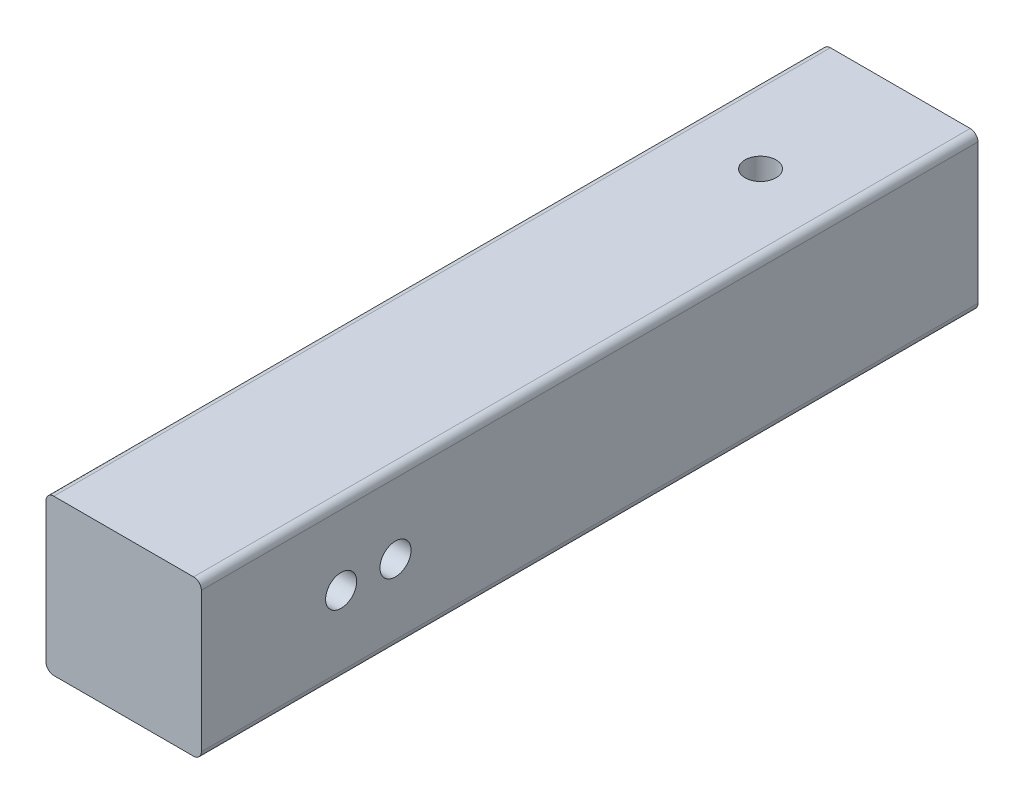
ISO-10303-21;
HEADER;
FILE_DESCRIPTION(('STEP AP214'),'2;1');
FILE_NAME('part.step','',(''),(''),'','','');
FILE_SCHEMA(('AUTOMOTIVE_DESIGN { 1 0 10303 214 1 1 1 1 }'));
ENDSEC;
DATA;
#1=APPLICATION_CONTEXT('core data for automotive mechanical design processes');
#2=APPLICATION_PROTOCOL_DEFINITION('international standard','automotive_design',2000,#1);
#3=PRODUCT_CONTEXT('',#1,'mechanical');
#4=PRODUCT('Part','Part','',(#3));
#5=PRODUCT_RELATED_PRODUCT_CATEGORY('part','',(#4));
#6=PRODUCT_DEFINITION_FORMATION('','',#4);
#7=PRODUCT_DEFINITION_CONTEXT('part definition',#1,'design');
#8=PRODUCT_DEFINITION('design','',#6,#7);
#9=PRODUCT_DEFINITION_SHAPE('','',#8);
#10=(LENGTH_UNIT() NAMED_UNIT(*) SI_UNIT(.MILLI.,.METRE.));
#11=(NAMED_UNIT(*) PLANE_ANGLE_UNIT() SI_UNIT($,.RADIAN.));
#12=(NAMED_UNIT(*) SI_UNIT($,.STERADIAN.) SOLID_ANGLE_UNIT());
#13=UNCERTAINTY_MEASURE_WITH_UNIT(LENGTH_MEASURE(1.E-05),#10,'distance_accuracy_value','');
#14=(GEOMETRIC_REPRESENTATION_CONTEXT(3) GLOBAL_UNCERTAINTY_ASSIGNED_CONTEXT((#13)) GLOBAL_UNIT_ASSIGNED_CONTEXT((#10,
#11,#12)) REPRESENTATION_CONTEXT('',''));
#15=CARTESIAN_POINT('',(0.,0.,0.));
#16=DIRECTION('',(0.,0.,1.));
#17=DIRECTION('',(1.,0.,0.));
#18=AXIS2_PLACEMENT_3D('',#15,#16,#17);
#19=CARTESIAN_POINT('',(0.,0.,100.));
#20=DIRECTION('',(1.,0.,0.));
#21=DIRECTION('',(0.,0.,-1.));
#22=AXIS2_PLACEMENT_3D('',#19,#20,#21);
#23=PLANE('',#22);
#24=CARTESIAN_POINT('',(0.,10.,75.));
#25=DIRECTION('',(1.,0.,0.));
#26=DIRECTION('',(0.,0.,-1.));
#27=AXIS2_PLACEMENT_3D('',#24,#25,#26);
#28=CIRCLE('',#27,2.);
#29=CARTESIAN_POINT('',(0.,10.,73.));
#30=VERTEX_POINT('',#29);
#31=EDGE_CURVE('E206',#30,#30,#28,.T.);
#32=ORIENTED_EDGE('',*,*,#31,.T.);
#33=EDGE_LOOP('',(#32));
#34=FACE_BOUND('',#33,.T.);
#35=CARTESIAN_POINT('',(0.,10.,82.));
#36=DIRECTION('',(-1.,0.,0.));
#37=DIRECTION('',(0.,0.,1.));
#38=AXIS2_PLACEMENT_3D('',#35,#36,#37);
#39=CIRCLE('',#38,2.);
#40=CARTESIAN_POINT('',(0.,10.,84.));
#41=VERTEX_POINT('',#40);
#42=EDGE_CURVE('E194',#41,#41,#39,.T.);
#43=ORIENTED_EDGE('',*,*,#42,.F.);
#44=EDGE_LOOP('',(#43));
#45=FACE_BOUND('',#44,.T.);
#46=DIRECTION('',(0.,-1.,0.));
#47=VECTOR('',#46,1.);
#48=CARTESIAN_POINT('',(0.,0.,0.));
#49=LINE('',#48,#47);
#50=CARTESIAN_POINT('',(0.,19.,0.));
#51=VERTEX_POINT('',#50);
#52=CARTESIAN_POINT('',(0.,1.,0.));
#53=VERTEX_POINT('',#52);
#54=EDGE_CURVE('E136',#51,#53,#49,.T.);
#55=ORIENTED_EDGE('',*,*,#54,.T.);
#56=DIRECTION('',(0.,0.,-1.));
#57=VECTOR('',#56,1.);
#58=CARTESIAN_POINT('',(0.,1.,100.));
#59=LINE('',#58,#57);
#60=CARTESIAN_POINT('',(0.,1.,100.));
#61=VERTEX_POINT('',#60);
#62=EDGE_CURVE('E111',#53,#61,#59,.F.);
#63=ORIENTED_EDGE('',*,*,#62,.T.);
#64=DIRECTION('',(0.,-1.,0.));
#65=VECTOR('',#64,1.);
#66=CARTESIAN_POINT('',(0.,0.,100.));
#67=LINE('',#66,#65);
#68=CARTESIAN_POINT('',(0.,19.,100.));
#69=VERTEX_POINT('',#68);
#70=EDGE_CURVE('E148',#69,#61,#67,.T.);
#71=ORIENTED_EDGE('',*,*,#70,.F.);
#72=DIRECTION('',(0.,0.,-1.));
#73=VECTOR('',#72,1.);
#74=CARTESIAN_POINT('',(0.,19.,100.));
#75=LINE('',#74,#73);
#76=EDGE_CURVE('E117',#69,#51,#75,.T.);
#77=ORIENTED_EDGE('',*,*,#76,.T.);
#78=EDGE_LOOP('',(#55,#63,#71,#77));
#79=FACE_BOUND('',#78,.T.);
#80=ADVANCED_FACE('F38',(#34,#45,#79),#23,.F.);
#81=CARTESIAN_POINT('',(0.,0.,100.));
#82=DIRECTION('',(0.,1.,0.));
#83=DIRECTION('',(0.,0.,1.));
#84=AXIS2_PLACEMENT_3D('',#81,#82,#83);
#85=PLANE('',#84);
#86=CARTESIAN_POINT('',(10.,0.,18.));
#87=DIRECTION('',(0.,1.,0.));
#88=DIRECTION('',(0.,0.,1.));
#89=AXIS2_PLACEMENT_3D('',#86,#87,#88);
#90=CIRCLE('',#89,2.);
#91=CARTESIAN_POINT('',(10.,0.,20.));
#92=VERTEX_POINT('',#91);
#93=EDGE_CURVE('E198',#92,#92,#90,.T.);
#94=ORIENTED_EDGE('',*,*,#93,.T.);
#95=EDGE_LOOP('',(#94));
#96=FACE_BOUND('',#95,.T.);
#97=DIRECTION('',(1.,0.,0.));
#98=VECTOR('',#97,1.);
#99=CARTESIAN_POINT('',(0.,0.,100.));
#100=LINE('',#99,#98);
#101=CARTESIAN_POINT('',(1.,0.,100.));
#102=VERTEX_POINT('',#101);
#103=CARTESIAN_POINT('',(19.,0.,100.));
#104=VERTEX_POINT('',#103);
#105=EDGE_CURVE('E127',#102,#104,#100,.T.);
#106=ORIENTED_EDGE('',*,*,#105,.F.);
#107=DIRECTION('',(0.,0.,-1.));
#108=VECTOR('',#107,1.);
#109=CARTESIAN_POINT('',(1.,0.,100.));
#110=LINE('',#109,#108);
#111=CARTESIAN_POINT('',(1.,0.,0.));
#112=VERTEX_POINT('',#111);
#113=EDGE_CURVE('E110',#102,#112,#110,.T.);
#114=ORIENTED_EDGE('',*,*,#113,.T.);
#115=DIRECTION('',(1.,0.,0.));
#116=VECTOR('',#115,1.);
#117=CARTESIAN_POINT('',(0.,0.,0.));
#118=LINE('',#117,#116);
#119=CARTESIAN_POINT('',(19.,0.,0.));
#120=VERTEX_POINT('',#119);
#121=EDGE_CURVE('E124',#112,#120,#118,.T.);
#122=ORIENTED_EDGE('',*,*,#121,.T.);
#123=DIRECTION('',(0.,0.,-1.));
#124=VECTOR('',#123,1.);
#125=CARTESIAN_POINT('',(19.,0.,100.));
#126=LINE('',#125,#124);
#127=EDGE_CURVE('E130',#120,#104,#126,.F.);
#128=ORIENTED_EDGE('',*,*,#127,.T.);
#129=EDGE_LOOP('',(#106,#114,#122,#128));
#130=FACE_BOUND('',#129,.T.);
#131=ADVANCED_FACE('F123',(#96,#130),#85,.F.);
#132=CARTESIAN_POINT('',(20.,0.,100.));
#133=DIRECTION('',(-1.,0.,0.));
#134=DIRECTION('',(0.,0.,1.));
#135=AXIS2_PLACEMENT_3D('',#132,#133,#134);
#136=PLANE('',#135);
#137=CARTESIAN_POINT('',(20.,10.,75.));
#138=DIRECTION('',(1.,0.,0.));
#139=DIRECTION('',(0.,0.,-1.));
#140=AXIS2_PLACEMENT_3D('',#137,#138,#139);
#141=CIRCLE('',#140,2.);
#142=CARTESIAN_POINT('',(20.,10.,73.));
#143=VERTEX_POINT('',#142);
#144=EDGE_CURVE('E207',#143,#143,#141,.T.);
#145=ORIENTED_EDGE('',*,*,#144,.F.);
#146=EDGE_LOOP('',(#145));
#147=FACE_BOUND('',#146,.T.);
#148=CARTESIAN_POINT('',(20.,10.,82.));
#149=DIRECTION('',(-1.,0.,0.));
#150=DIRECTION('',(0.,0.,1.));
#151=AXIS2_PLACEMENT_3D('',#148,#149,#150);
#152=CIRCLE('',#151,2.);
#153=CARTESIAN_POINT('',(20.,10.,84.));
#154=VERTEX_POINT('',#153);
#155=EDGE_CURVE('E42',#154,#154,#152,.T.);
#156=ORIENTED_EDGE('',*,*,#155,.T.);
#157=EDGE_LOOP('',(#156));
#158=FACE_BOUND('',#157,.T.);
#159=DIRECTION('',(0.,1.,0.));
#160=VECTOR('',#159,1.);
#161=CARTESIAN_POINT('',(20.,0.,100.));
#162=LINE('',#161,#160);
#163=CARTESIAN_POINT('',(20.,1.,100.));
#164=VERTEX_POINT('',#163);
#165=CARTESIAN_POINT('',(20.,19.,100.));
#166=VERTEX_POINT('',#165);
#167=EDGE_CURVE('E185',#164,#166,#162,.T.);
#168=ORIENTED_EDGE('',*,*,#167,.F.);
#169=DIRECTION('',(0.,0.,-1.));
#170=VECTOR('',#169,1.);
#171=CARTESIAN_POINT('',(20.,1.,100.));
#172=LINE('',#171,#170);
#173=CARTESIAN_POINT('',(20.,1.,0.));
#174=VERTEX_POINT('',#173);
#175=EDGE_CURVE('E178',#164,#174,#172,.T.);
#176=ORIENTED_EDGE('',*,*,#175,.T.);
#177=DIRECTION('',(0.,1.,0.));
#178=VECTOR('',#177,1.);
#179=CARTESIAN_POINT('',(20.,0.,0.));
#180=LINE('',#179,#178);
#181=CARTESIAN_POINT('',(20.,19.,0.));
#182=VERTEX_POINT('',#181);
#183=EDGE_CURVE('E135',#174,#182,#180,.T.);
#184=ORIENTED_EDGE('',*,*,#183,.T.);
#185=DIRECTION('',(0.,0.,-1.));
#186=VECTOR('',#185,1.);
#187=CARTESIAN_POINT('',(20.,19.,100.));
#188=LINE('',#187,#186);
#189=EDGE_CURVE('E175',#182,#166,#188,.F.);
#190=ORIENTED_EDGE('',*,*,#189,.T.);
#191=EDGE_LOOP('',(#168,#176,#184,#190));
#192=FACE_BOUND('',#191,.T.);
#193=ADVANCED_FACE('F224',(#147,#158,#192),#136,.F.);
#194=CARTESIAN_POINT('',(0.,20.,100.));
#195=DIRECTION('',(0.,-1.,0.));
#196=DIRECTION('',(0.,0.,-1.));
#197=AXIS2_PLACEMENT_3D('',#194,#195,#196);
#198=PLANE('',#197);
#199=CARTESIAN_POINT('',(10.,20.,18.));
#200=DIRECTION('',(0.,1.,0.));
#201=DIRECTION('',(0.,0.,1.));
#202=AXIS2_PLACEMENT_3D('',#199,#200,#201);
#203=CIRCLE('',#202,2.);
#204=CARTESIAN_POINT('',(10.,20.,20.));
#205=VERTEX_POINT('',#204);
#206=EDGE_CURVE('E202',#205,#205,#203,.T.);
#207=ORIENTED_EDGE('',*,*,#206,.F.);
#208=EDGE_LOOP('',(#207));
#209=FACE_BOUND('',#208,.T.);
#210=DIRECTION('',(-1.,0.,0.));
#211=VECTOR('',#210,1.);
#212=CARTESIAN_POINT('',(0.,20.,100.));
#213=LINE('',#212,#211);
#214=CARTESIAN_POINT('',(19.,20.,100.));
#215=VERTEX_POINT('',#214);
#216=CARTESIAN_POINT('',(1.,20.,100.));
#217=VERTEX_POINT('',#216);
#218=EDGE_CURVE('E150',#215,#217,#213,.T.);
#219=ORIENTED_EDGE('',*,*,#218,.F.);
#220=DIRECTION('',(0.,0.,-1.));
#221=VECTOR('',#220,1.);
#222=CARTESIAN_POINT('',(19.,20.,100.));
#223=LINE('',#222,#221);
#224=CARTESIAN_POINT('',(19.,20.,0.));
#225=VERTEX_POINT('',#224);
#226=EDGE_CURVE('E11',#215,#225,#223,.T.);
#227=ORIENTED_EDGE('',*,*,#226,.T.);
#228=DIRECTION('',(-1.,0.,0.));
#229=VECTOR('',#228,1.);
#230=CARTESIAN_POINT('',(0.,20.,0.));
#231=LINE('',#230,#229);
#232=CARTESIAN_POINT('',(1.,20.,0.));
#233=VERTEX_POINT('',#232);
#234=EDGE_CURVE('E141',#225,#233,#231,.T.);
#235=ORIENTED_EDGE('',*,*,#234,.T.);
#236=DIRECTION('',(0.,0.,-1.));
#237=VECTOR('',#236,1.);
#238=CARTESIAN_POINT('',(1.,20.,100.));
#239=LINE('',#238,#237);
#240=EDGE_CURVE('E48',#233,#217,#239,.F.);
#241=ORIENTED_EDGE('',*,*,#240,.T.);
#242=EDGE_LOOP('',(#219,#227,#235,#241));
#243=FACE_BOUND('',#242,.T.);
#244=ADVANCED_FACE('F227',(#209,#243),#198,.F.);
#245=CARTESIAN_POINT('',(0.,0.,100.));
#246=DIRECTION('',(0.,0.,-1.));
#247=DIRECTION('',(-1.,0.,0.));
#248=AXIS2_PLACEMENT_3D('',#245,#246,#247);
#249=PLANE('',#248);
#250=ORIENTED_EDGE('',*,*,#70,.T.);
#251=CARTESIAN_POINT('',(1.,1.,100.));
#252=DIRECTION('',(0.,0.,-1.));
#253=DIRECTION('',(-1.,0.,0.));
#254=AXIS2_PLACEMENT_3D('',#251,#252,#253);
#255=CIRCLE('',#254,1.);
#256=EDGE_CURVE('E172',#61,#102,#255,.F.);
#257=ORIENTED_EDGE('',*,*,#256,.T.);
#258=ORIENTED_EDGE('',*,*,#105,.T.);
#259=CARTESIAN_POINT('',(19.,1.,100.));
#260=DIRECTION('',(0.,0.,-1.));
#261=DIRECTION('',(-1.,0.,0.));
#262=AXIS2_PLACEMENT_3D('',#259,#260,#261);
#263=CIRCLE('',#262,1.);
#264=EDGE_CURVE('E169',#104,#164,#263,.F.);
#265=ORIENTED_EDGE('',*,*,#264,.T.);
#266=ORIENTED_EDGE('',*,*,#167,.T.);
#267=CARTESIAN_POINT('',(19.,19.,100.));
#268=DIRECTION('',(0.,0.,-1.));
#269=DIRECTION('',(-1.,0.,0.));
#270=AXIS2_PLACEMENT_3D('',#267,#268,#269);
#271=CIRCLE('',#270,1.);
#272=EDGE_CURVE('E61',#166,#215,#271,.F.);
#273=ORIENTED_EDGE('',*,*,#272,.T.);
#274=ORIENTED_EDGE('',*,*,#218,.T.);
#275=CARTESIAN_POINT('',(1.,19.,100.));
#276=DIRECTION('',(0.,0.,-1.));
#277=DIRECTION('',(-1.,0.,0.));
#278=AXIS2_PLACEMENT_3D('',#275,#276,#277);
#279=CIRCLE('',#278,1.);
#280=EDGE_CURVE('E164',#217,#69,#279,.F.);
#281=ORIENTED_EDGE('',*,*,#280,.T.);
#282=EDGE_LOOP('',(#250,#257,#258,#265,#266,#273,#274,#281));
#283=FACE_BOUND('',#282,.T.);
#284=ADVANCED_FACE('F238',(#283),#249,.F.);
#285=CARTESIAN_POINT('',(0.,0.,0.));
#286=DIRECTION('',(0.,0.,-1.));
#287=DIRECTION('',(-1.,0.,0.));
#288=AXIS2_PLACEMENT_3D('',#285,#286,#287);
#289=PLANE('',#288);
#290=ORIENTED_EDGE('',*,*,#121,.F.);
#291=CARTESIAN_POINT('',(1.,1.,0.));
#292=DIRECTION('',(0.,0.,-1.));
#293=DIRECTION('',(-1.,0.,0.));
#294=AXIS2_PLACEMENT_3D('',#291,#292,#293);
#295=CIRCLE('',#294,1.);
#296=EDGE_CURVE('E106',#112,#53,#295,.T.);
#297=ORIENTED_EDGE('',*,*,#296,.T.);
#298=ORIENTED_EDGE('',*,*,#54,.F.);
#299=CARTESIAN_POINT('',(1.,19.,0.));
#300=DIRECTION('',(0.,0.,-1.));
#301=DIRECTION('',(-1.,0.,0.));
#302=AXIS2_PLACEMENT_3D('',#299,#300,#301);
#303=CIRCLE('',#302,1.);
#304=EDGE_CURVE('E129',#51,#233,#303,.T.);
#305=ORIENTED_EDGE('',*,*,#304,.T.);
#306=ORIENTED_EDGE('',*,*,#234,.F.);
#307=CARTESIAN_POINT('',(19.,19.,0.));
#308=DIRECTION('',(0.,0.,-1.));
#309=DIRECTION('',(-1.,0.,0.));
#310=AXIS2_PLACEMENT_3D('',#307,#308,#309);
#311=CIRCLE('',#310,1.);
#312=EDGE_CURVE('E154',#225,#182,#311,.T.);
#313=ORIENTED_EDGE('',*,*,#312,.T.);
#314=ORIENTED_EDGE('',*,*,#183,.F.);
#315=CARTESIAN_POINT('',(19.,1.,0.));
#316=DIRECTION('',(0.,0.,-1.));
#317=DIRECTION('',(-1.,0.,0.));
#318=AXIS2_PLACEMENT_3D('',#315,#316,#317);
#319=CIRCLE('',#318,1.);
#320=EDGE_CURVE('E118',#174,#120,#319,.T.);
#321=ORIENTED_EDGE('',*,*,#320,.T.);
#322=EDGE_LOOP('',(#290,#297,#298,#305,#306,#313,#314,#321));
#323=FACE_BOUND('',#322,.T.);
#324=ADVANCED_FACE('F132',(#323),#289,.T.);
#325=CARTESIAN_POINT('',(1.,1.,100.));
#326=DIRECTION('',(0.,0.,-1.));
#327=DIRECTION('',(-1.,0.,0.));
#328=AXIS2_PLACEMENT_3D('',#325,#326,#327);
#329=CYLINDRICAL_SURFACE('',#328,1.);
#330=ORIENTED_EDGE('',*,*,#256,.F.);
#331=ORIENTED_EDGE('',*,*,#62,.F.);
#332=ORIENTED_EDGE('',*,*,#296,.F.);
#333=ORIENTED_EDGE('',*,*,#113,.F.);
#334=EDGE_LOOP('',(#330,#331,#332,#333));
#335=FACE_BOUND('',#334,.T.);
#336=ADVANCED_FACE('F109',(#335),#329,.T.);
#337=CARTESIAN_POINT('',(19.,1.,100.));
#338=DIRECTION('',(0.,0.,-1.));
#339=DIRECTION('',(-1.,0.,0.));
#340=AXIS2_PLACEMENT_3D('',#337,#338,#339);
#341=CYLINDRICAL_SURFACE('',#340,1.);
#342=ORIENTED_EDGE('',*,*,#264,.F.);
#343=ORIENTED_EDGE('',*,*,#127,.F.);
#344=ORIENTED_EDGE('',*,*,#320,.F.);
#345=ORIENTED_EDGE('',*,*,#175,.F.);
#346=EDGE_LOOP('',(#342,#343,#344,#345));
#347=FACE_BOUND('',#346,.T.);
#348=ADVANCED_FACE('F237',(#347),#341,.T.);
#349=CARTESIAN_POINT('',(19.,19.,100.));
#350=DIRECTION('',(0.,0.,-1.));
#351=DIRECTION('',(-1.,0.,0.));
#352=AXIS2_PLACEMENT_3D('',#349,#350,#351);
#353=CYLINDRICAL_SURFACE('',#352,1.);
#354=ORIENTED_EDGE('',*,*,#272,.F.);
#355=ORIENTED_EDGE('',*,*,#189,.F.);
#356=ORIENTED_EDGE('',*,*,#312,.F.);
#357=ORIENTED_EDGE('',*,*,#226,.F.);
#358=EDGE_LOOP('',(#354,#355,#356,#357));
#359=FACE_BOUND('',#358,.T.);
#360=ADVANCED_FACE('F261',(#359),#353,.T.);
#361=CARTESIAN_POINT('',(1.,19.,100.));
#362=DIRECTION('',(0.,0.,-1.));
#363=DIRECTION('',(-1.,0.,0.));
#364=AXIS2_PLACEMENT_3D('',#361,#362,#363);
#365=CYLINDRICAL_SURFACE('',#364,1.);
#366=ORIENTED_EDGE('',*,*,#280,.F.);
#367=ORIENTED_EDGE('',*,*,#240,.F.);
#368=ORIENTED_EDGE('',*,*,#304,.F.);
#369=ORIENTED_EDGE('',*,*,#76,.F.);
#370=EDGE_LOOP('',(#366,#367,#368,#369));
#371=FACE_BOUND('',#370,.T.);
#372=ADVANCED_FACE('F40',(#371),#365,.T.);
#373=CARTESIAN_POINT('',(110.,10.,82.));
#374=DIRECTION('',(-1.,0.,0.));
#375=DIRECTION('',(0.,0.,1.));
#376=AXIS2_PLACEMENT_3D('',#373,#374,#375);
#377=CYLINDRICAL_SURFACE('',#376,2.);
#378=ORIENTED_EDGE('',*,*,#42,.T.);
#379=EDGE_LOOP('',(#378));
#380=FACE_BOUND('',#379,.T.);
#381=ORIENTED_EDGE('',*,*,#155,.F.);
#382=EDGE_LOOP('',(#381));
#383=FACE_BOUND('',#382,.T.);
#384=ADVANCED_FACE('F267',(#380,#383),#377,.F.);
#385=CARTESIAN_POINT('',(10.,-90.,18.));
#386=DIRECTION('',(0.,1.,0.));
#387=DIRECTION('',(0.,0.,1.));
#388=AXIS2_PLACEMENT_3D('',#385,#386,#387);
#389=CYLINDRICAL_SURFACE('',#388,2.);
#390=ORIENTED_EDGE('',*,*,#206,.T.);
#391=EDGE_LOOP('',(#390));
#392=FACE_BOUND('',#391,.T.);
#393=ORIENTED_EDGE('',*,*,#93,.F.);
#394=EDGE_LOOP('',(#393));
#395=FACE_BOUND('',#394,.T.);
#396=ADVANCED_FACE('F220',(#392,#395),#389,.F.);
#397=CARTESIAN_POINT('',(0.,10.,75.));
#398=DIRECTION('',(1.,0.,0.));
#399=DIRECTION('',(0.,0.,-1.));
#400=AXIS2_PLACEMENT_3D('',#397,#398,#399);
#401=CYLINDRICAL_SURFACE('',#400,2.);
#402=ORIENTED_EDGE('',*,*,#31,.F.);
#403=EDGE_LOOP('',(#402));
#404=FACE_BOUND('',#403,.T.);
#405=ORIENTED_EDGE('',*,*,#144,.T.);
#406=EDGE_LOOP('',(#405));
#407=FACE_BOUND('',#406,.T.);
#408=ADVANCED_FACE('F217',(#404,#407),#401,.F.);
#409=CLOSED_SHELL('',(#80,#131,#193,#244,#284,#324,#336,#348,#360,#372,#384,#396,#408));
#410=MANIFOLD_SOLID_BREP('B2',#409);
#411=ADVANCED_BREP_SHAPE_REPRESENTATION('',(#18,#410),#14);
#412=SHAPE_DEFINITION_REPRESENTATION(#9,#411);
ENDSEC;
END-ISO-10303-21;
